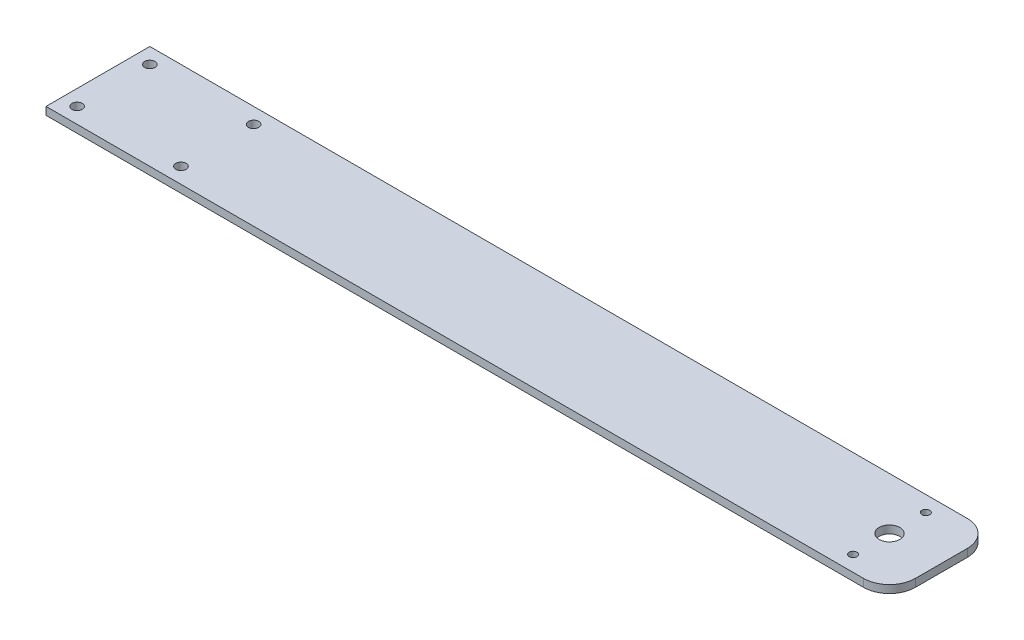
ISO-10303-21;
HEADER;
FILE_DESCRIPTION(('STEP AP214'),'2;1');
FILE_NAME('part.step','',(''),(''),'','','');
FILE_SCHEMA(('AUTOMOTIVE_DESIGN { 1 0 10303 214 1 1 1 1 }'));
ENDSEC;
DATA;
#1=APPLICATION_CONTEXT('core data for automotive mechanical design processes');
#2=APPLICATION_PROTOCOL_DEFINITION('international standard','automotive_design',2000,#1);
#3=PRODUCT_CONTEXT('',#1,'mechanical');
#4=PRODUCT('Part','Part','',(#3));
#5=PRODUCT_RELATED_PRODUCT_CATEGORY('part','',(#4));
#6=PRODUCT_DEFINITION_FORMATION('','',#4);
#7=PRODUCT_DEFINITION_CONTEXT('part definition',#1,'design');
#8=PRODUCT_DEFINITION('design','',#6,#7);
#9=PRODUCT_DEFINITION_SHAPE('','',#8);
#10=(LENGTH_UNIT() NAMED_UNIT(*) SI_UNIT(.MILLI.,.METRE.));
#11=(NAMED_UNIT(*) PLANE_ANGLE_UNIT() SI_UNIT($,.RADIAN.));
#12=(NAMED_UNIT(*) SI_UNIT($,.STERADIAN.) SOLID_ANGLE_UNIT());
#13=UNCERTAINTY_MEASURE_WITH_UNIT(LENGTH_MEASURE(1.E-05),#10,'distance_accuracy_value','');
#14=(GEOMETRIC_REPRESENTATION_CONTEXT(3) GLOBAL_UNCERTAINTY_ASSIGNED_CONTEXT((#13)) GLOBAL_UNIT_ASSIGNED_CONTEXT((#10,
#11,#12)) REPRESENTATION_CONTEXT('',''));
#15=CARTESIAN_POINT('',(0.,0.,0.));
#16=DIRECTION('',(0.,0.,1.));
#17=DIRECTION('',(1.,0.,0.));
#18=AXIS2_PLACEMENT_3D('',#15,#16,#17);
#19=CARTESIAN_POINT('',(0.,3.,0.));
#20=DIRECTION('',(0.,1.,0.));
#21=DIRECTION('',(0.,0.,1.));
#22=AXIS2_PLACEMENT_3D('',#19,#20,#21);
#23=PLANE('',#22);
#24=CARTESIAN_POINT('',(142.5,3.,-14.));
#25=DIRECTION('',(0.,1.,0.));
#26=DIRECTION('',(0.,0.,1.));
#27=AXIS2_PLACEMENT_3D('',#24,#25,#26);
#28=CIRCLE('',#27,1.5);
#29=CARTESIAN_POINT('',(142.5,3.,-12.5));
#30=VERTEX_POINT('',#29);
#31=EDGE_CURVE('E204',#30,#30,#28,.T.);
#32=ORIENTED_EDGE('',*,*,#31,.F.);
#33=EDGE_LOOP('',(#32));
#34=FACE_BOUND('',#33,.T.);
#35=CARTESIAN_POINT('',(-156.5,3.,14.));
#36=DIRECTION('',(0.,1.,0.));
#37=DIRECTION('',(0.,0.,1.));
#38=AXIS2_PLACEMENT_3D('',#35,#36,#37);
#39=CIRCLE('',#38,2.);
#40=CARTESIAN_POINT('',(-156.5,3.,16.));
#41=VERTEX_POINT('',#40);
#42=EDGE_CURVE('E216',#41,#41,#39,.T.);
#43=ORIENTED_EDGE('',*,*,#42,.F.);
#44=EDGE_LOOP('',(#43));
#45=FACE_BOUND('',#44,.T.);
#46=CARTESIAN_POINT('',(-116.5,3.,-14.));
#47=DIRECTION('',(0.,1.,0.));
#48=DIRECTION('',(0.,0.,1.));
#49=AXIS2_PLACEMENT_3D('',#46,#47,#48);
#50=CIRCLE('',#49,2.);
#51=CARTESIAN_POINT('',(-116.5,3.,-12.));
#52=VERTEX_POINT('',#51);
#53=EDGE_CURVE('E228',#52,#52,#50,.T.);
#54=ORIENTED_EDGE('',*,*,#53,.F.);
#55=EDGE_LOOP('',(#54));
#56=FACE_BOUND('',#55,.T.);
#57=DIRECTION('',(1.,0.,0.));
#58=VECTOR('',#57,1.);
#59=CARTESIAN_POINT('',(-162.5,3.,20.));
#60=LINE('',#59,#58);
#61=CARTESIAN_POINT('',(-162.5,3.,20.));
#62=VERTEX_POINT('',#61);
#63=CARTESIAN_POINT('',(152.5,3.,20.));
#64=VERTEX_POINT('',#63);
#65=EDGE_CURVE('E108',#62,#64,#60,.T.);
#66=ORIENTED_EDGE('',*,*,#65,.T.);
#67=CARTESIAN_POINT('',(152.5,3.,10.));
#68=DIRECTION('',(0.,1.,0.));
#69=DIRECTION('',(0.,0.,1.));
#70=AXIS2_PLACEMENT_3D('',#67,#68,#69);
#71=CIRCLE('',#70,10.);
#72=CARTESIAN_POINT('',(162.5,3.,10.));
#73=VERTEX_POINT('',#72);
#74=EDGE_CURVE('E41',#64,#73,#71,.T.);
#75=ORIENTED_EDGE('',*,*,#74,.T.);
#76=DIRECTION('',(0.,0.,-1.));
#77=VECTOR('',#76,1.);
#78=CARTESIAN_POINT('',(162.5,3.,-20.));
#79=LINE('',#78,#77);
#80=CARTESIAN_POINT('',(162.5,3.,-10.));
#81=VERTEX_POINT('',#80);
#82=EDGE_CURVE('E94',#73,#81,#79,.T.);
#83=ORIENTED_EDGE('',*,*,#82,.T.);
#84=CARTESIAN_POINT('',(152.5,3.,-10.));
#85=DIRECTION('',(0.,1.,0.));
#86=DIRECTION('',(0.,0.,1.));
#87=AXIS2_PLACEMENT_3D('',#84,#85,#86);
#88=CIRCLE('',#87,10.);
#89=CARTESIAN_POINT('',(152.5,3.,-20.));
#90=VERTEX_POINT('',#89);
#91=EDGE_CURVE('E48',#81,#90,#88,.T.);
#92=ORIENTED_EDGE('',*,*,#91,.T.);
#93=DIRECTION('',(-1.,0.,0.));
#94=VECTOR('',#93,1.);
#95=CARTESIAN_POINT('',(-162.5,3.,-20.));
#96=LINE('',#95,#94);
#97=CARTESIAN_POINT('',(-162.5,3.,-20.));
#98=VERTEX_POINT('',#97);
#99=EDGE_CURVE('E86',#90,#98,#96,.T.);
#100=ORIENTED_EDGE('',*,*,#99,.T.);
#101=DIRECTION('',(0.,0.,1.));
#102=VECTOR('',#101,1.);
#103=CARTESIAN_POINT('',(-162.5,3.,-20.));
#104=LINE('',#103,#102);
#105=EDGE_CURVE('E90',#98,#62,#104,.T.);
#106=ORIENTED_EDGE('',*,*,#105,.T.);
#107=EDGE_LOOP('',(#66,#75,#83,#92,#100,#106));
#108=FACE_BOUND('',#107,.T.);
#109=CARTESIAN_POINT('',(-156.5,3.,-14.));
#110=DIRECTION('',(0.,1.,0.));
#111=DIRECTION('',(0.,0.,1.));
#112=AXIS2_PLACEMENT_3D('',#109,#110,#111);
#113=CIRCLE('',#112,2.);
#114=CARTESIAN_POINT('',(-156.5,3.,-12.));
#115=VERTEX_POINT('',#114);
#116=EDGE_CURVE('E116',#115,#115,#113,.T.);
#117=ORIENTED_EDGE('',*,*,#116,.F.);
#118=EDGE_LOOP('',(#117));
#119=FACE_BOUND('',#118,.T.);
#120=CARTESIAN_POINT('',(-116.5,3.,14.));
#121=DIRECTION('',(0.,1.,0.));
#122=DIRECTION('',(0.,0.,1.));
#123=AXIS2_PLACEMENT_3D('',#120,#121,#122);
#124=CIRCLE('',#123,2.);
#125=CARTESIAN_POINT('',(-116.5,3.,16.));
#126=VERTEX_POINT('',#125);
#127=EDGE_CURVE('E222',#126,#126,#124,.T.);
#128=ORIENTED_EDGE('',*,*,#127,.F.);
#129=EDGE_LOOP('',(#128));
#130=FACE_BOUND('',#129,.T.);
#131=CARTESIAN_POINT('',(142.5,3.,0.));
#132=DIRECTION('',(0.,1.,0.));
#133=DIRECTION('',(0.,0.,1.));
#134=AXIS2_PLACEMENT_3D('',#131,#132,#133);
#135=CIRCLE('',#134,3.99999999999999);
#136=CARTESIAN_POINT('',(142.5,3.,3.99999999999999));
#137=VERTEX_POINT('',#136);
#138=EDGE_CURVE('E210',#137,#137,#135,.T.);
#139=ORIENTED_EDGE('',*,*,#138,.F.);
#140=EDGE_LOOP('',(#139));
#141=FACE_BOUND('',#140,.T.);
#142=CARTESIAN_POINT('',(142.5,3.,14.));
#143=DIRECTION('',(0.,1.,0.));
#144=DIRECTION('',(0.,0.,1.));
#145=AXIS2_PLACEMENT_3D('',#142,#143,#144);
#146=CIRCLE('',#145,1.5);
#147=CARTESIAN_POINT('',(142.5,3.,15.5));
#148=VERTEX_POINT('',#147);
#149=EDGE_CURVE('E195',#148,#148,#146,.T.);
#150=ORIENTED_EDGE('',*,*,#149,.F.);
#151=EDGE_LOOP('',(#150));
#152=FACE_BOUND('',#151,.T.);
#153=ADVANCED_FACE('F33',(#34,#45,#56,#108,#119,#130,#141,#152),#23,.T.);
#154=CARTESIAN_POINT('',(0.,0.,0.));
#155=DIRECTION('',(0.,1.,0.));
#156=DIRECTION('',(0.,0.,1.));
#157=AXIS2_PLACEMENT_3D('',#154,#155,#156);
#158=PLANE('',#157);
#159=DIRECTION('',(0.,0.,-1.));
#160=VECTOR('',#159,1.);
#161=CARTESIAN_POINT('',(162.5,0.,-20.));
#162=LINE('',#161,#160);
#163=CARTESIAN_POINT('',(162.5,0.,10.));
#164=VERTEX_POINT('',#163);
#165=CARTESIAN_POINT('',(162.5,0.,-10.));
#166=VERTEX_POINT('',#165);
#167=EDGE_CURVE('E113',#164,#166,#162,.T.);
#168=ORIENTED_EDGE('',*,*,#167,.F.);
#169=CARTESIAN_POINT('',(152.5,0.,10.));
#170=DIRECTION('',(0.,1.,0.));
#171=DIRECTION('',(0.,0.,1.));
#172=AXIS2_PLACEMENT_3D('',#169,#170,#171);
#173=CIRCLE('',#172,10.);
#174=CARTESIAN_POINT('',(152.5,0.,20.));
#175=VERTEX_POINT('',#174);
#176=EDGE_CURVE('E129',#164,#175,#173,.F.);
#177=ORIENTED_EDGE('',*,*,#176,.T.);
#178=DIRECTION('',(1.,0.,0.));
#179=VECTOR('',#178,1.);
#180=CARTESIAN_POINT('',(-162.5,0.,20.));
#181=LINE('',#180,#179);
#182=CARTESIAN_POINT('',(-162.5,0.,20.));
#183=VERTEX_POINT('',#182);
#184=EDGE_CURVE('E120',#183,#175,#181,.T.);
#185=ORIENTED_EDGE('',*,*,#184,.F.);
#186=DIRECTION('',(0.,0.,1.));
#187=VECTOR('',#186,1.);
#188=CARTESIAN_POINT('',(-162.5,0.,-20.));
#189=LINE('',#188,#187);
#190=CARTESIAN_POINT('',(-162.5,0.,-20.));
#191=VERTEX_POINT('',#190);
#192=EDGE_CURVE('E118',#191,#183,#189,.T.);
#193=ORIENTED_EDGE('',*,*,#192,.F.);
#194=DIRECTION('',(-1.,0.,0.));
#195=VECTOR('',#194,1.);
#196=CARTESIAN_POINT('',(-162.5,0.,-20.));
#197=LINE('',#196,#195);
#198=CARTESIAN_POINT('',(152.5,0.,-20.));
#199=VERTEX_POINT('',#198);
#200=EDGE_CURVE('E100',#199,#191,#197,.T.);
#201=ORIENTED_EDGE('',*,*,#200,.F.);
#202=CARTESIAN_POINT('',(152.5,0.,-10.));
#203=DIRECTION('',(0.,1.,0.));
#204=DIRECTION('',(0.,0.,1.));
#205=AXIS2_PLACEMENT_3D('',#202,#203,#204);
#206=CIRCLE('',#205,10.);
#207=EDGE_CURVE('E127',#199,#166,#206,.F.);
#208=ORIENTED_EDGE('',*,*,#207,.T.);
#209=EDGE_LOOP('',(#168,#177,#185,#193,#201,#208));
#210=FACE_BOUND('',#209,.T.);
#211=CARTESIAN_POINT('',(-156.5,0.,-14.));
#212=DIRECTION('',(0.,1.,0.));
#213=DIRECTION('',(0.,0.,1.));
#214=AXIS2_PLACEMENT_3D('',#211,#212,#213);
#215=CIRCLE('',#214,2.);
#216=CARTESIAN_POINT('',(-156.5,0.,-12.));
#217=VERTEX_POINT('',#216);
#218=EDGE_CURVE('E231',#217,#217,#215,.T.);
#219=ORIENTED_EDGE('',*,*,#218,.T.);
#220=EDGE_LOOP('',(#219));
#221=FACE_BOUND('',#220,.T.);
#222=CARTESIAN_POINT('',(-116.5,0.,-14.));
#223=DIRECTION('',(0.,1.,0.));
#224=DIRECTION('',(0.,0.,1.));
#225=AXIS2_PLACEMENT_3D('',#222,#223,#224);
#226=CIRCLE('',#225,2.);
#227=CARTESIAN_POINT('',(-116.5,0.,-12.));
#228=VERTEX_POINT('',#227);
#229=EDGE_CURVE('E225',#228,#228,#226,.T.);
#230=ORIENTED_EDGE('',*,*,#229,.T.);
#231=EDGE_LOOP('',(#230));
#232=FACE_BOUND('',#231,.T.);
#233=CARTESIAN_POINT('',(-116.5,0.,14.));
#234=DIRECTION('',(0.,1.,0.));
#235=DIRECTION('',(0.,0.,1.));
#236=AXIS2_PLACEMENT_3D('',#233,#234,#235);
#237=CIRCLE('',#236,2.);
#238=CARTESIAN_POINT('',(-116.5,0.,16.));
#239=VERTEX_POINT('',#238);
#240=EDGE_CURVE('E219',#239,#239,#237,.T.);
#241=ORIENTED_EDGE('',*,*,#240,.T.);
#242=EDGE_LOOP('',(#241));
#243=FACE_BOUND('',#242,.T.);
#244=CARTESIAN_POINT('',(-156.5,0.,14.));
#245=DIRECTION('',(0.,1.,0.));
#246=DIRECTION('',(0.,0.,1.));
#247=AXIS2_PLACEMENT_3D('',#244,#245,#246);
#248=CIRCLE('',#247,2.);
#249=CARTESIAN_POINT('',(-156.5,0.,16.));
#250=VERTEX_POINT('',#249);
#251=EDGE_CURVE('E213',#250,#250,#248,.T.);
#252=ORIENTED_EDGE('',*,*,#251,.T.);
#253=EDGE_LOOP('',(#252));
#254=FACE_BOUND('',#253,.T.);
#255=CARTESIAN_POINT('',(142.5,0.,0.));
#256=DIRECTION('',(0.,1.,0.));
#257=DIRECTION('',(0.,0.,1.));
#258=AXIS2_PLACEMENT_3D('',#255,#256,#257);
#259=CIRCLE('',#258,3.99999999999999);
#260=CARTESIAN_POINT('',(142.5,0.,3.99999999999999));
#261=VERTEX_POINT('',#260);
#262=EDGE_CURVE('E207',#261,#261,#259,.T.);
#263=ORIENTED_EDGE('',*,*,#262,.T.);
#264=EDGE_LOOP('',(#263));
#265=FACE_BOUND('',#264,.T.);
#266=CARTESIAN_POINT('',(142.5,0.,-14.));
#267=DIRECTION('',(0.,1.,0.));
#268=DIRECTION('',(0.,0.,1.));
#269=AXIS2_PLACEMENT_3D('',#266,#267,#268);
#270=CIRCLE('',#269,1.5);
#271=CARTESIAN_POINT('',(142.5,0.,-12.5));
#272=VERTEX_POINT('',#271);
#273=EDGE_CURVE('E201',#272,#272,#270,.T.);
#274=ORIENTED_EDGE('',*,*,#273,.T.);
#275=EDGE_LOOP('',(#274));
#276=FACE_BOUND('',#275,.T.);
#277=CARTESIAN_POINT('',(142.5,0.,14.));
#278=DIRECTION('',(0.,1.,0.));
#279=DIRECTION('',(0.,0.,1.));
#280=AXIS2_PLACEMENT_3D('',#277,#278,#279);
#281=CIRCLE('',#280,1.5);
#282=CARTESIAN_POINT('',(142.5,0.,15.5));
#283=VERTEX_POINT('',#282);
#284=EDGE_CURVE('E198',#283,#283,#281,.T.);
#285=ORIENTED_EDGE('',*,*,#284,.T.);
#286=EDGE_LOOP('',(#285));
#287=FACE_BOUND('',#286,.T.);
#288=ADVANCED_FACE('F143',(#210,#221,#232,#243,#254,#265,#276,#287),#158,.F.);
#289=CARTESIAN_POINT('',(162.5,3.,-20.));
#290=DIRECTION('',(-1.,0.,0.));
#291=DIRECTION('',(0.,0.,1.));
#292=AXIS2_PLACEMENT_3D('',#289,#290,#291);
#293=PLANE('',#292);
#294=ORIENTED_EDGE('',*,*,#82,.F.);
#295=DIRECTION('',(0.,-1.,0.));
#296=VECTOR('',#295,1.);
#297=CARTESIAN_POINT('',(162.5,3.,10.));
#298=LINE('',#297,#296);
#299=EDGE_CURVE('E124',#73,#164,#298,.T.);
#300=ORIENTED_EDGE('',*,*,#299,.T.);
#301=ORIENTED_EDGE('',*,*,#167,.T.);
#302=DIRECTION('',(0.,-1.,0.));
#303=VECTOR('',#302,1.);
#304=CARTESIAN_POINT('',(162.5,3.,-10.));
#305=LINE('',#304,#303);
#306=EDGE_CURVE('E103',#166,#81,#305,.F.);
#307=ORIENTED_EDGE('',*,*,#306,.T.);
#308=EDGE_LOOP('',(#294,#300,#301,#307));
#309=FACE_BOUND('',#308,.T.);
#310=ADVANCED_FACE('F137',(#309),#293,.F.);
#311=CARTESIAN_POINT('',(-162.5,3.,-20.));
#312=DIRECTION('',(0.,0.,1.));
#313=DIRECTION('',(1.,0.,0.));
#314=AXIS2_PLACEMENT_3D('',#311,#312,#313);
#315=PLANE('',#314);
#316=ORIENTED_EDGE('',*,*,#99,.F.);
#317=DIRECTION('',(0.,-1.,0.));
#318=VECTOR('',#317,1.);
#319=CARTESIAN_POINT('',(152.5,3.,-20.));
#320=LINE('',#319,#318);
#321=EDGE_CURVE('E11',#90,#199,#320,.T.);
#322=ORIENTED_EDGE('',*,*,#321,.T.);
#323=ORIENTED_EDGE('',*,*,#200,.T.);
#324=DIRECTION('',(0.,-1.,0.));
#325=VECTOR('',#324,1.);
#326=CARTESIAN_POINT('',(-162.5,3.,-20.));
#327=LINE('',#326,#325);
#328=EDGE_CURVE('E97',#98,#191,#327,.T.);
#329=ORIENTED_EDGE('',*,*,#328,.F.);
#330=EDGE_LOOP('',(#316,#322,#323,#329));
#331=FACE_BOUND('',#330,.T.);
#332=ADVANCED_FACE('F98',(#331),#315,.F.);
#333=CARTESIAN_POINT('',(-162.5,3.,-20.));
#334=DIRECTION('',(1.,0.,0.));
#335=DIRECTION('',(0.,0.,-1.));
#336=AXIS2_PLACEMENT_3D('',#333,#334,#335);
#337=PLANE('',#336);
#338=ORIENTED_EDGE('',*,*,#192,.T.);
#339=DIRECTION('',(0.,-1.,0.));
#340=VECTOR('',#339,1.);
#341=CARTESIAN_POINT('',(-162.5,3.,20.));
#342=LINE('',#341,#340);
#343=EDGE_CURVE('E104',#62,#183,#342,.T.);
#344=ORIENTED_EDGE('',*,*,#343,.F.);
#345=ORIENTED_EDGE('',*,*,#105,.F.);
#346=ORIENTED_EDGE('',*,*,#328,.T.);
#347=EDGE_LOOP('',(#338,#344,#345,#346));
#348=FACE_BOUND('',#347,.T.);
#349=ADVANCED_FACE('F106',(#348),#337,.F.);
#350=CARTESIAN_POINT('',(-162.5,3.,20.));
#351=DIRECTION('',(0.,0.,-1.));
#352=DIRECTION('',(-1.,0.,0.));
#353=AXIS2_PLACEMENT_3D('',#350,#351,#352);
#354=PLANE('',#353);
#355=ORIENTED_EDGE('',*,*,#184,.T.);
#356=DIRECTION('',(0.,-1.,0.));
#357=VECTOR('',#356,1.);
#358=CARTESIAN_POINT('',(152.5,3.,20.));
#359=LINE('',#358,#357);
#360=EDGE_CURVE('E56',#175,#64,#359,.F.);
#361=ORIENTED_EDGE('',*,*,#360,.T.);
#362=ORIENTED_EDGE('',*,*,#65,.F.);
#363=ORIENTED_EDGE('',*,*,#343,.T.);
#364=EDGE_LOOP('',(#355,#361,#362,#363));
#365=FACE_BOUND('',#364,.T.);
#366=ADVANCED_FACE('F145',(#365),#354,.F.);
#367=CARTESIAN_POINT('',(-156.5,3.,-14.));
#368=DIRECTION('',(0.,-1.,0.));
#369=DIRECTION('',(0.,0.,-1.));
#370=AXIS2_PLACEMENT_3D('',#367,#368,#369);
#371=CYLINDRICAL_SURFACE('',#370,2.);
#372=ORIENTED_EDGE('',*,*,#116,.T.);
#373=EDGE_LOOP('',(#372));
#374=FACE_BOUND('',#373,.T.);
#375=ORIENTED_EDGE('',*,*,#218,.F.);
#376=EDGE_LOOP('',(#375));
#377=FACE_BOUND('',#376,.T.);
#378=ADVANCED_FACE('F147',(#374,#377),#371,.F.);
#379=CARTESIAN_POINT('',(-116.5,3.,-14.));
#380=DIRECTION('',(0.,-1.,0.));
#381=DIRECTION('',(0.,0.,-1.));
#382=AXIS2_PLACEMENT_3D('',#379,#380,#381);
#383=CYLINDRICAL_SURFACE('',#382,2.);
#384=ORIENTED_EDGE('',*,*,#53,.T.);
#385=EDGE_LOOP('',(#384));
#386=FACE_BOUND('',#385,.T.);
#387=ORIENTED_EDGE('',*,*,#229,.F.);
#388=EDGE_LOOP('',(#387));
#389=FACE_BOUND('',#388,.T.);
#390=ADVANCED_FACE('F153',(#386,#389),#383,.F.);
#391=CARTESIAN_POINT('',(-116.5,3.,14.));
#392=DIRECTION('',(0.,-1.,0.));
#393=DIRECTION('',(0.,0.,-1.));
#394=AXIS2_PLACEMENT_3D('',#391,#392,#393);
#395=CYLINDRICAL_SURFACE('',#394,2.);
#396=ORIENTED_EDGE('',*,*,#127,.T.);
#397=EDGE_LOOP('',(#396));
#398=FACE_BOUND('',#397,.T.);
#399=ORIENTED_EDGE('',*,*,#240,.F.);
#400=EDGE_LOOP('',(#399));
#401=FACE_BOUND('',#400,.T.);
#402=ADVANCED_FACE('F169',(#398,#401),#395,.F.);
#403=CARTESIAN_POINT('',(-156.5,3.,14.));
#404=DIRECTION('',(0.,-1.,0.));
#405=DIRECTION('',(0.,0.,-1.));
#406=AXIS2_PLACEMENT_3D('',#403,#404,#405);
#407=CYLINDRICAL_SURFACE('',#406,2.);
#408=ORIENTED_EDGE('',*,*,#42,.T.);
#409=EDGE_LOOP('',(#408));
#410=FACE_BOUND('',#409,.T.);
#411=ORIENTED_EDGE('',*,*,#251,.F.);
#412=EDGE_LOOP('',(#411));
#413=FACE_BOUND('',#412,.T.);
#414=ADVANCED_FACE('F173',(#410,#413),#407,.F.);
#415=CARTESIAN_POINT('',(142.5,3.,0.));
#416=DIRECTION('',(0.,-1.,0.));
#417=DIRECTION('',(0.,0.,-1.));
#418=AXIS2_PLACEMENT_3D('',#415,#416,#417);
#419=CYLINDRICAL_SURFACE('',#418,3.99999999999999);
#420=ORIENTED_EDGE('',*,*,#138,.T.);
#421=EDGE_LOOP('',(#420));
#422=FACE_BOUND('',#421,.T.);
#423=ORIENTED_EDGE('',*,*,#262,.F.);
#424=EDGE_LOOP('',(#423));
#425=FACE_BOUND('',#424,.T.);
#426=ADVANCED_FACE('F177',(#422,#425),#419,.F.);
#427=CARTESIAN_POINT('',(142.5,3.,-14.));
#428=DIRECTION('',(0.,-1.,0.));
#429=DIRECTION('',(0.,0.,-1.));
#430=AXIS2_PLACEMENT_3D('',#427,#428,#429);
#431=CYLINDRICAL_SURFACE('',#430,1.5);
#432=ORIENTED_EDGE('',*,*,#31,.T.);
#433=EDGE_LOOP('',(#432));
#434=FACE_BOUND('',#433,.T.);
#435=ORIENTED_EDGE('',*,*,#273,.F.);
#436=EDGE_LOOP('',(#435));
#437=FACE_BOUND('',#436,.T.);
#438=ADVANCED_FACE('F181',(#434,#437),#431,.F.);
#439=CARTESIAN_POINT('',(142.5,3.,14.));
#440=DIRECTION('',(0.,-1.,0.));
#441=DIRECTION('',(0.,0.,-1.));
#442=AXIS2_PLACEMENT_3D('',#439,#440,#441);
#443=CYLINDRICAL_SURFACE('',#442,1.5);
#444=ORIENTED_EDGE('',*,*,#149,.T.);
#445=EDGE_LOOP('',(#444));
#446=FACE_BOUND('',#445,.T.);
#447=ORIENTED_EDGE('',*,*,#284,.F.);
#448=EDGE_LOOP('',(#447));
#449=FACE_BOUND('',#448,.T.);
#450=ADVANCED_FACE('F185',(#446,#449),#443,.F.);
#451=CARTESIAN_POINT('',(152.5,3.,10.));
#452=DIRECTION('',(0.,-1.,0.));
#453=DIRECTION('',(0.,0.,-1.));
#454=AXIS2_PLACEMENT_3D('',#451,#452,#453);
#455=CYLINDRICAL_SURFACE('',#454,10.);
#456=ORIENTED_EDGE('',*,*,#74,.F.);
#457=ORIENTED_EDGE('',*,*,#360,.F.);
#458=ORIENTED_EDGE('',*,*,#176,.F.);
#459=ORIENTED_EDGE('',*,*,#299,.F.);
#460=EDGE_LOOP('',(#456,#457,#458,#459));
#461=FACE_BOUND('',#460,.T.);
#462=ADVANCED_FACE('F140',(#461),#455,.T.);
#463=CARTESIAN_POINT('',(152.5,3.,-10.));
#464=DIRECTION('',(0.,-1.,0.));
#465=DIRECTION('',(0.,0.,-1.));
#466=AXIS2_PLACEMENT_3D('',#463,#464,#465);
#467=CYLINDRICAL_SURFACE('',#466,10.);
#468=ORIENTED_EDGE('',*,*,#91,.F.);
#469=ORIENTED_EDGE('',*,*,#306,.F.);
#470=ORIENTED_EDGE('',*,*,#207,.F.);
#471=ORIENTED_EDGE('',*,*,#321,.F.);
#472=EDGE_LOOP('',(#468,#469,#470,#471));
#473=FACE_BOUND('',#472,.T.);
#474=ADVANCED_FACE('F35',(#473),#467,.T.);
#475=CLOSED_SHELL('',(#153,#288,#310,#332,#349,#366,#378,#390,#402,#414,#426,#438,#450,#462,#474));
#476=MANIFOLD_SOLID_BREP('B2',#475);
#477=ADVANCED_BREP_SHAPE_REPRESENTATION('',(#18,#476),#14);
#478=SHAPE_DEFINITION_REPRESENTATION(#9,#477);
ENDSEC;
END-ISO-10303-21;
